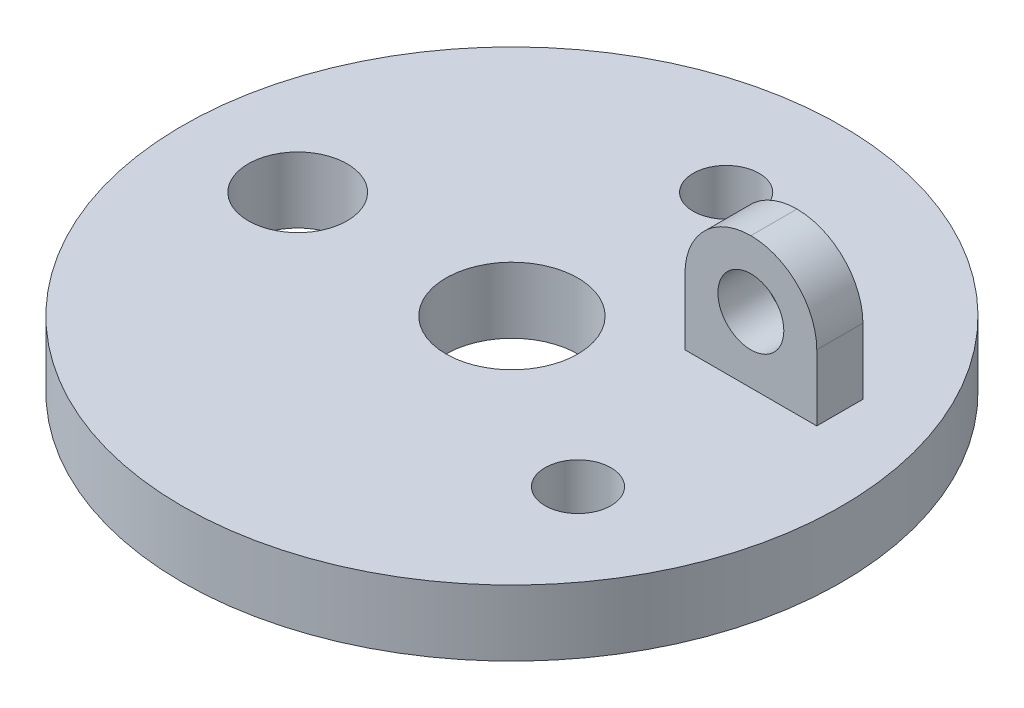
ISO-10303-21;
HEADER;
FILE_DESCRIPTION(('STEP AP214'),'2;1');
FILE_NAME('part.step','',(''),(''),'','','');
FILE_SCHEMA(('AUTOMOTIVE_DESIGN { 1 0 10303 214 1 1 1 1 }'));
ENDSEC;
DATA;
#1=APPLICATION_CONTEXT('core data for automotive mechanical design processes');
#2=APPLICATION_PROTOCOL_DEFINITION('international standard','automotive_design',2000,#1);
#3=PRODUCT_CONTEXT('',#1,'mechanical');
#4=PRODUCT('Part','Part','',(#3));
#5=PRODUCT_RELATED_PRODUCT_CATEGORY('part','',(#4));
#6=PRODUCT_DEFINITION_FORMATION('','',#4);
#7=PRODUCT_DEFINITION_CONTEXT('part definition',#1,'design');
#8=PRODUCT_DEFINITION('design','',#6,#7);
#9=PRODUCT_DEFINITION_SHAPE('','',#8);
#10=(LENGTH_UNIT() NAMED_UNIT(*) SI_UNIT(.MILLI.,.METRE.));
#11=(NAMED_UNIT(*) PLANE_ANGLE_UNIT() SI_UNIT($,.RADIAN.));
#12=(NAMED_UNIT(*) SI_UNIT($,.STERADIAN.) SOLID_ANGLE_UNIT());
#13=UNCERTAINTY_MEASURE_WITH_UNIT(LENGTH_MEASURE(1.E-05),#10,'distance_accuracy_value','');
#14=(GEOMETRIC_REPRESENTATION_CONTEXT(3) GLOBAL_UNCERTAINTY_ASSIGNED_CONTEXT((#13)) GLOBAL_UNIT_ASSIGNED_CONTEXT((#10,
#11,#12)) REPRESENTATION_CONTEXT('',''));
#15=CARTESIAN_POINT('',(0.,0.,0.));
#16=DIRECTION('',(0.,0.,1.));
#17=DIRECTION('',(1.,0.,0.));
#18=AXIS2_PLACEMENT_3D('',#15,#16,#17);
#19=CARTESIAN_POINT('',(0.,5.,0.));
#20=DIRECTION('',(0.,1.,0.));
#21=DIRECTION('',(0.,0.,1.));
#22=AXIS2_PLACEMENT_3D('',#19,#20,#21);
#23=PLANE('',#22);
#24=CARTESIAN_POINT('',(0.,5.,-32.5));
#25=DIRECTION('',(0.,1.,0.));
#26=DIRECTION('',(0.,0.,1.));
#27=AXIS2_PLACEMENT_3D('',#24,#25,#26);
#28=CIRCLE('',#27,5.);
#29=CARTESIAN_POINT('',(0.,5.,-27.5));
#30=VERTEX_POINT('',#29);
#31=EDGE_CURVE('E136',#30,#30,#28,.T.);
#32=ORIENTED_EDGE('',*,*,#31,.F.);
#33=EDGE_LOOP('',(#32));
#34=FACE_BOUND('',#33,.T.);
#35=CARTESIAN_POINT('',(27.4382616598463,5.,17.4181456270697));
#36=DIRECTION('',(0.,1.,0.));
#37=DIRECTION('',(0.,0.,1.));
#38=AXIS2_PLACEMENT_3D('',#35,#36,#37);
#39=CIRCLE('',#38,5.);
#40=CARTESIAN_POINT('',(27.4382616598463,5.,22.4181456270697));
#41=VERTEX_POINT('',#40);
#42=EDGE_CURVE('E152',#41,#41,#39,.T.);
#43=ORIENTED_EDGE('',*,*,#42,.F.);
#44=EDGE_LOOP('',(#43));
#45=FACE_BOUND('',#44,.T.);
#46=CARTESIAN_POINT('',(0.,5.,0.));
#47=DIRECTION('',(0.,1.,0.));
#48=DIRECTION('',(0.,0.,1.));
#49=AXIS2_PLACEMENT_3D('',#46,#47,#48);
#50=CIRCLE('',#49,50.);
#51=CARTESIAN_POINT('',(0.,5.,50.));
#52=VERTEX_POINT('',#51);
#53=EDGE_CURVE('E160',#52,#52,#50,.T.);
#54=ORIENTED_EDGE('',*,*,#53,.T.);
#55=EDGE_LOOP('',(#54));
#56=FACE_BOUND('',#55,.T.);
#57=CARTESIAN_POINT('',(-32.5,5.,0.));
#58=DIRECTION('',(0.,1.,0.));
#59=DIRECTION('',(0.,0.,1.));
#60=AXIS2_PLACEMENT_3D('',#57,#58,#59);
#61=CIRCLE('',#60,7.5);
#62=CARTESIAN_POINT('',(-32.5,5.,7.5));
#63=VERTEX_POINT('',#62);
#64=EDGE_CURVE('E144',#63,#63,#61,.T.);
#65=ORIENTED_EDGE('',*,*,#64,.F.);
#66=EDGE_LOOP('',(#65));
#67=FACE_BOUND('',#66,.T.);
#68=CARTESIAN_POINT('',(0.,5.,0.));
#69=DIRECTION('',(0.,1.,0.));
#70=DIRECTION('',(0.,0.,1.));
#71=AXIS2_PLACEMENT_3D('',#68,#69,#70);
#72=CIRCLE('',#71,10.);
#73=CARTESIAN_POINT('',(0.,5.,10.));
#74=VERTEX_POINT('',#73);
#75=EDGE_CURVE('E128',#74,#74,#72,.T.);
#76=ORIENTED_EDGE('',*,*,#75,.F.);
#77=EDGE_LOOP('',(#76));
#78=FACE_BOUND('',#77,.T.);
#79=DIRECTION('',(-1.,0.,0.));
#80=VECTOR('',#79,1.);
#81=CARTESIAN_POINT('',(17.5709758475848,5.,-15.6757175717572));
#82=LINE('',#81,#80);
#83=CARTESIAN_POINT('',(37.5709758475848,5.,-15.6757175717572));
#84=VERTEX_POINT('',#83);
#85=CARTESIAN_POINT('',(17.5709758475848,5.,-15.6757175717572));
#86=VERTEX_POINT('',#85);
#87=EDGE_CURVE('E91',#84,#86,#82,.T.);
#88=ORIENTED_EDGE('',*,*,#87,.F.);
#89=DIRECTION('',(0.,0.,-1.));
#90=VECTOR('',#89,1.);
#91=CARTESIAN_POINT('',(37.5709758475848,5.,-15.6757175717572));
#92=LINE('',#91,#90);
#93=CARTESIAN_POINT('',(37.5709758475848,5.,-8.6757175717572));
#94=VERTEX_POINT('',#93);
#95=EDGE_CURVE('E100',#94,#84,#92,.T.);
#96=ORIENTED_EDGE('',*,*,#95,.F.);
#97=DIRECTION('',(1.,0.,0.));
#98=VECTOR('',#97,1.);
#99=CARTESIAN_POINT('',(17.5709758475848,5.,-8.6757175717572));
#100=LINE('',#99,#98);
#101=CARTESIAN_POINT('',(17.5709758475848,5.,-8.6757175717572));
#102=VERTEX_POINT('',#101);
#103=EDGE_CURVE('E115',#102,#94,#100,.T.);
#104=ORIENTED_EDGE('',*,*,#103,.F.);
#105=DIRECTION('',(0.,0.,1.));
#106=VECTOR('',#105,1.);
#107=CARTESIAN_POINT('',(17.5709758475848,5.,-15.6757175717572));
#108=LINE('',#107,#106);
#109=EDGE_CURVE('E110',#86,#102,#108,.T.);
#110=ORIENTED_EDGE('',*,*,#109,.F.);
#111=EDGE_LOOP('',(#88,#96,#104,#110));
#112=FACE_BOUND('',#111,.T.);
#113=ADVANCED_FACE('F44',(#34,#45,#56,#67,#78,#112),#23,.T.);
#114=CARTESIAN_POINT('',(0.,-5.,0.));
#115=DIRECTION('',(0.,1.,0.));
#116=DIRECTION('',(0.,0.,1.));
#117=AXIS2_PLACEMENT_3D('',#114,#115,#116);
#118=PLANE('',#117);
#119=CARTESIAN_POINT('',(0.,-5.,0.));
#120=DIRECTION('',(0.,1.,0.));
#121=DIRECTION('',(0.,0.,1.));
#122=AXIS2_PLACEMENT_3D('',#119,#120,#121);
#123=CIRCLE('',#122,50.);
#124=CARTESIAN_POINT('',(0.,-5.,50.));
#125=VERTEX_POINT('',#124);
#126=EDGE_CURVE('E156',#125,#125,#123,.T.);
#127=ORIENTED_EDGE('',*,*,#126,.F.);
#128=EDGE_LOOP('',(#127));
#129=FACE_BOUND('',#128,.T.);
#130=CARTESIAN_POINT('',(27.4382616598463,-5.,17.4181456270697));
#131=DIRECTION('',(0.,1.,0.));
#132=DIRECTION('',(0.,0.,1.));
#133=AXIS2_PLACEMENT_3D('',#130,#131,#132);
#134=CIRCLE('',#133,5.);
#135=CARTESIAN_POINT('',(27.4382616598463,-5.,22.4181456270697));
#136=VERTEX_POINT('',#135);
#137=EDGE_CURVE('E148',#136,#136,#134,.T.);
#138=ORIENTED_EDGE('',*,*,#137,.T.);
#139=EDGE_LOOP('',(#138));
#140=FACE_BOUND('',#139,.T.);
#141=CARTESIAN_POINT('',(-32.5,-5.,0.));
#142=DIRECTION('',(0.,1.,0.));
#143=DIRECTION('',(0.,0.,1.));
#144=AXIS2_PLACEMENT_3D('',#141,#142,#143);
#145=CIRCLE('',#144,7.5);
#146=CARTESIAN_POINT('',(-32.5,-5.,7.5));
#147=VERTEX_POINT('',#146);
#148=EDGE_CURVE('E140',#147,#147,#145,.T.);
#149=ORIENTED_EDGE('',*,*,#148,.T.);
#150=EDGE_LOOP('',(#149));
#151=FACE_BOUND('',#150,.T.);
#152=CARTESIAN_POINT('',(0.,-5.,-32.5));
#153=DIRECTION('',(0.,1.,0.));
#154=DIRECTION('',(0.,0.,1.));
#155=AXIS2_PLACEMENT_3D('',#152,#153,#154);
#156=CIRCLE('',#155,5.);
#157=CARTESIAN_POINT('',(0.,-5.,-27.5));
#158=VERTEX_POINT('',#157);
#159=EDGE_CURVE('E132',#158,#158,#156,.T.);
#160=ORIENTED_EDGE('',*,*,#159,.T.);
#161=EDGE_LOOP('',(#160));
#162=FACE_BOUND('',#161,.T.);
#163=CARTESIAN_POINT('',(0.,-5.,0.));
#164=DIRECTION('',(0.,1.,0.));
#165=DIRECTION('',(0.,0.,1.));
#166=AXIS2_PLACEMENT_3D('',#163,#164,#165);
#167=CIRCLE('',#166,10.);
#168=CARTESIAN_POINT('',(0.,-5.,10.));
#169=VERTEX_POINT('',#168);
#170=EDGE_CURVE('E96',#169,#169,#167,.T.);
#171=ORIENTED_EDGE('',*,*,#170,.T.);
#172=EDGE_LOOP('',(#171));
#173=FACE_BOUND('',#172,.T.);
#174=ADVANCED_FACE('F268',(#129,#140,#151,#162,#173),#118,.F.);
#175=CARTESIAN_POINT('',(0.,5.,0.));
#176=DIRECTION('',(0.,-1.,0.));
#177=DIRECTION('',(0.,0.,-1.));
#178=AXIS2_PLACEMENT_3D('',#175,#176,#177);
#179=CYLINDRICAL_SURFACE('',#178,50.);
#180=ORIENTED_EDGE('',*,*,#53,.F.);
#181=EDGE_LOOP('',(#180));
#182=FACE_BOUND('',#181,.T.);
#183=ORIENTED_EDGE('',*,*,#126,.T.);
#184=EDGE_LOOP('',(#183));
#185=FACE_BOUND('',#184,.T.);
#186=ADVANCED_FACE('F274',(#182,#185),#179,.T.);
#187=CARTESIAN_POINT('',(27.4382616598463,5.,17.4181456270697));
#188=DIRECTION('',(0.,-1.,0.));
#189=DIRECTION('',(0.,0.,-1.));
#190=AXIS2_PLACEMENT_3D('',#187,#188,#189);
#191=CYLINDRICAL_SURFACE('',#190,5.);
#192=ORIENTED_EDGE('',*,*,#42,.T.);
#193=EDGE_LOOP('',(#192));
#194=FACE_BOUND('',#193,.T.);
#195=ORIENTED_EDGE('',*,*,#137,.F.);
#196=EDGE_LOOP('',(#195));
#197=FACE_BOUND('',#196,.T.);
#198=ADVANCED_FACE('F280',(#194,#197),#191,.F.);
#199=CARTESIAN_POINT('',(-32.5,5.,0.));
#200=DIRECTION('',(0.,-1.,0.));
#201=DIRECTION('',(0.,0.,-1.));
#202=AXIS2_PLACEMENT_3D('',#199,#200,#201);
#203=CYLINDRICAL_SURFACE('',#202,7.5);
#204=ORIENTED_EDGE('',*,*,#64,.T.);
#205=EDGE_LOOP('',(#204));
#206=FACE_BOUND('',#205,.T.);
#207=ORIENTED_EDGE('',*,*,#148,.F.);
#208=EDGE_LOOP('',(#207));
#209=FACE_BOUND('',#208,.T.);
#210=ADVANCED_FACE('F338',(#206,#209),#203,.F.);
#211=CARTESIAN_POINT('',(0.,5.,-32.5));
#212=DIRECTION('',(0.,-1.,0.));
#213=DIRECTION('',(0.,0.,-1.));
#214=AXIS2_PLACEMENT_3D('',#211,#212,#213);
#215=CYLINDRICAL_SURFACE('',#214,5.);
#216=ORIENTED_EDGE('',*,*,#31,.T.);
#217=EDGE_LOOP('',(#216));
#218=FACE_BOUND('',#217,.T.);
#219=ORIENTED_EDGE('',*,*,#159,.F.);
#220=EDGE_LOOP('',(#219));
#221=FACE_BOUND('',#220,.T.);
#222=ADVANCED_FACE('F328',(#218,#221),#215,.F.);
#223=CARTESIAN_POINT('',(0.,5.,0.));
#224=DIRECTION('',(0.,-1.,0.));
#225=DIRECTION('',(0.,0.,-1.));
#226=AXIS2_PLACEMENT_3D('',#223,#224,#225);
#227=CYLINDRICAL_SURFACE('',#226,10.);
#228=ORIENTED_EDGE('',*,*,#75,.T.);
#229=EDGE_LOOP('',(#228));
#230=FACE_BOUND('',#229,.T.);
#231=ORIENTED_EDGE('',*,*,#170,.F.);
#232=EDGE_LOOP('',(#231));
#233=FACE_BOUND('',#232,.T.);
#234=ADVANCED_FACE('F318',(#230,#233),#227,.F.);
#235=CARTESIAN_POINT('',(37.5709758475848,25.,-15.6757175717572));
#236=DIRECTION('',(-1.,0.,0.));
#237=DIRECTION('',(0.,0.,1.));
#238=AXIS2_PLACEMENT_3D('',#235,#236,#237);
#239=PLANE('',#238);
#240=DIRECTION('',(0.,-1.,0.));
#241=VECTOR('',#240,1.);
#242=CARTESIAN_POINT('',(37.5709758475848,25.,-15.6757175717572));
#243=LINE('',#242,#241);
#244=CARTESIAN_POINT('',(37.5709758475848,15.,-15.6757175717572));
#245=VERTEX_POINT('',#244);
#246=EDGE_CURVE('E87',#245,#84,#243,.T.);
#247=ORIENTED_EDGE('',*,*,#246,.F.);
#248=DIRECTION('',(0.,0.,-1.));
#249=VECTOR('',#248,1.);
#250=CARTESIAN_POINT('',(37.5709758475848,15.,-8.6757175717572));
#251=LINE('',#250,#249);
#252=CARTESIAN_POINT('',(37.5709758475848,15.,-8.6757175717572));
#253=VERTEX_POINT('',#252);
#254=EDGE_CURVE('E11',#245,#253,#251,.F.);
#255=ORIENTED_EDGE('',*,*,#254,.T.);
#256=DIRECTION('',(0.,-1.,0.));
#257=VECTOR('',#256,1.);
#258=CARTESIAN_POINT('',(37.5709758475848,25.,-8.6757175717572));
#259=LINE('',#258,#257);
#260=EDGE_CURVE('E103',#253,#94,#259,.T.);
#261=ORIENTED_EDGE('',*,*,#260,.T.);
#262=ORIENTED_EDGE('',*,*,#95,.T.);
#263=EDGE_LOOP('',(#247,#255,#261,#262));
#264=FACE_BOUND('',#263,.T.);
#265=ADVANCED_FACE('F101',(#264),#239,.F.);
#266=CARTESIAN_POINT('',(17.5709758475848,25.,-15.6757175717572));
#267=DIRECTION('',(0.,0.,1.));
#268=DIRECTION('',(1.,0.,0.));
#269=AXIS2_PLACEMENT_3D('',#266,#267,#268);
#270=PLANE('',#269);
#271=CARTESIAN_POINT('',(27.5709758475848,15.,-15.6757175717572));
#272=DIRECTION('',(0.,0.,1.));
#273=DIRECTION('',(1.,0.,0.));
#274=AXIS2_PLACEMENT_3D('',#271,#272,#273);
#275=CIRCLE('',#274,5.);
#276=CARTESIAN_POINT('',(32.5709758475848,15.,-15.6757175717572));
#277=VERTEX_POINT('',#276);
#278=EDGE_CURVE('E231',#277,#277,#275,.T.);
#279=ORIENTED_EDGE('',*,*,#278,.T.);
#280=EDGE_LOOP('',(#279));
#281=FACE_BOUND('',#280,.T.);
#282=DIRECTION('',(0.,-1.,0.));
#283=VECTOR('',#282,1.);
#284=CARTESIAN_POINT('',(17.5709758475848,25.,-15.6757175717572));
#285=LINE('',#284,#283);
#286=CARTESIAN_POINT('',(17.5709758475848,15.,-15.6757175717572));
#287=VERTEX_POINT('',#286);
#288=EDGE_CURVE('E97',#287,#86,#285,.T.);
#289=ORIENTED_EDGE('',*,*,#288,.F.);
#290=CARTESIAN_POINT('',(27.5709758475848,15.,-15.6757175717572));
#291=DIRECTION('',(0.,0.,1.));
#292=DIRECTION('',(1.,0.,0.));
#293=AXIS2_PLACEMENT_3D('',#290,#291,#292);
#294=CIRCLE('',#293,10.);
#295=CARTESIAN_POINT('',(27.5709758475848,25.,-15.6757175717572));
#296=VERTEX_POINT('',#295);
#297=EDGE_CURVE('E54',#287,#296,#294,.F.);
#298=ORIENTED_EDGE('',*,*,#297,.T.);
#299=CARTESIAN_POINT('',(27.5709758475848,15.,-15.6757175717572));
#300=DIRECTION('',(0.,0.,1.));
#301=DIRECTION('',(1.,0.,0.));
#302=AXIS2_PLACEMENT_3D('',#299,#300,#301);
#303=CIRCLE('',#302,10.);
#304=EDGE_CURVE('E61',#296,#245,#303,.F.);
#305=ORIENTED_EDGE('',*,*,#304,.T.);
#306=ORIENTED_EDGE('',*,*,#246,.T.);
#307=ORIENTED_EDGE('',*,*,#87,.T.);
#308=EDGE_LOOP('',(#289,#298,#305,#306,#307));
#309=FACE_BOUND('',#308,.T.);
#310=ADVANCED_FACE('F89',(#281,#309),#270,.F.);
#311=CARTESIAN_POINT('',(17.5709758475848,25.,-15.6757175717572));
#312=DIRECTION('',(1.,0.,0.));
#313=DIRECTION('',(0.,0.,-1.));
#314=AXIS2_PLACEMENT_3D('',#311,#312,#313);
#315=PLANE('',#314);
#316=DIRECTION('',(0.,-1.,0.));
#317=VECTOR('',#316,1.);
#318=CARTESIAN_POINT('',(17.5709758475848,25.,-8.6757175717572));
#319=LINE('',#318,#317);
#320=CARTESIAN_POINT('',(17.5709758475848,15.,-8.6757175717572));
#321=VERTEX_POINT('',#320);
#322=EDGE_CURVE('E123',#321,#102,#319,.T.);
#323=ORIENTED_EDGE('',*,*,#322,.F.);
#324=DIRECTION('',(0.,0.,1.));
#325=VECTOR('',#324,1.);
#326=CARTESIAN_POINT('',(17.5709758475848,15.,-15.6757175717572));
#327=LINE('',#326,#325);
#328=EDGE_CURVE('E173',#321,#287,#327,.F.);
#329=ORIENTED_EDGE('',*,*,#328,.T.);
#330=ORIENTED_EDGE('',*,*,#288,.T.);
#331=ORIENTED_EDGE('',*,*,#109,.T.);
#332=EDGE_LOOP('',(#323,#329,#330,#331));
#333=FACE_BOUND('',#332,.T.);
#334=ADVANCED_FACE('F249',(#333),#315,.F.);
#335=CARTESIAN_POINT('',(17.5709758475848,25.,-8.6757175717572));
#336=DIRECTION('',(0.,0.,-1.));
#337=DIRECTION('',(-1.,0.,0.));
#338=AXIS2_PLACEMENT_3D('',#335,#336,#337);
#339=PLANE('',#338);
#340=CARTESIAN_POINT('',(27.5709758475848,15.,-8.6757175717572));
#341=DIRECTION('',(0.,0.,1.));
#342=DIRECTION('',(1.,0.,0.));
#343=AXIS2_PLACEMENT_3D('',#340,#341,#342);
#344=CIRCLE('',#343,5.);
#345=CARTESIAN_POINT('',(32.5709758475848,15.,-8.6757175717572));
#346=VERTEX_POINT('',#345);
#347=EDGE_CURVE('E236',#346,#346,#344,.T.);
#348=ORIENTED_EDGE('',*,*,#347,.F.);
#349=EDGE_LOOP('',(#348));
#350=FACE_BOUND('',#349,.T.);
#351=CARTESIAN_POINT('',(27.5709758475848,15.,-8.6757175717572));
#352=DIRECTION('',(0.,0.,-1.));
#353=DIRECTION('',(-1.,0.,0.));
#354=AXIS2_PLACEMENT_3D('',#351,#352,#353);
#355=CIRCLE('',#354,10.);
#356=CARTESIAN_POINT('',(27.5709758475848,25.,-8.6757175717572));
#357=VERTEX_POINT('',#356);
#358=EDGE_CURVE('E164',#253,#357,#355,.F.);
#359=ORIENTED_EDGE('',*,*,#358,.T.);
#360=CARTESIAN_POINT('',(27.5709758475848,15.,-8.6757175717572));
#361=DIRECTION('',(0.,0.,-1.));
#362=DIRECTION('',(-1.,0.,0.));
#363=AXIS2_PLACEMENT_3D('',#360,#361,#362);
#364=CIRCLE('',#363,10.);
#365=EDGE_CURVE('E170',#357,#321,#364,.F.);
#366=ORIENTED_EDGE('',*,*,#365,.T.);
#367=ORIENTED_EDGE('',*,*,#322,.T.);
#368=ORIENTED_EDGE('',*,*,#103,.T.);
#369=ORIENTED_EDGE('',*,*,#260,.F.);
#370=EDGE_LOOP('',(#359,#366,#367,#368,#369));
#371=FACE_BOUND('',#370,.T.);
#372=ADVANCED_FACE('F246',(#350,#371),#339,.F.);
#373=CARTESIAN_POINT('',(27.5709758475848,15.,0.));
#374=DIRECTION('',(0.,0.,1.));
#375=DIRECTION('',(1.,0.,0.));
#376=AXIS2_PLACEMENT_3D('',#373,#374,#375);
#377=CYLINDRICAL_SURFACE('',#376,10.);
#378=ORIENTED_EDGE('',*,*,#254,.F.);
#379=ORIENTED_EDGE('',*,*,#304,.F.);
#380=DIRECTION('',(0.,0.,-1.));
#381=VECTOR('',#380,1.);
#382=CARTESIAN_POINT('',(27.5709758475848,25.,-15.6757175717572));
#383=LINE('',#382,#381);
#384=EDGE_CURVE('E48',#357,#296,#383,.T.);
#385=ORIENTED_EDGE('',*,*,#384,.F.);
#386=ORIENTED_EDGE('',*,*,#358,.F.);
#387=EDGE_LOOP('',(#378,#379,#385,#386));
#388=FACE_BOUND('',#387,.T.);
#389=ADVANCED_FACE('F46',(#388),#377,.T.);
#390=CARTESIAN_POINT('',(27.5709758475848,15.,0.));
#391=DIRECTION('',(0.,0.,-1.));
#392=DIRECTION('',(-1.,0.,0.));
#393=AXIS2_PLACEMENT_3D('',#390,#391,#392);
#394=CYLINDRICAL_SURFACE('',#393,10.);
#395=ORIENTED_EDGE('',*,*,#297,.F.);
#396=ORIENTED_EDGE('',*,*,#328,.F.);
#397=ORIENTED_EDGE('',*,*,#365,.F.);
#398=ORIENTED_EDGE('',*,*,#384,.T.);
#399=EDGE_LOOP('',(#395,#396,#397,#398));
#400=FACE_BOUND('',#399,.T.);
#401=ADVANCED_FACE('F258',(#400),#394,.T.);
#402=CARTESIAN_POINT('',(27.5709758475848,15.,-50.));
#403=DIRECTION('',(0.,0.,1.));
#404=DIRECTION('',(1.,0.,0.));
#405=AXIS2_PLACEMENT_3D('',#402,#403,#404);
#406=CYLINDRICAL_SURFACE('',#405,5.);
#407=ORIENTED_EDGE('',*,*,#347,.T.);
#408=EDGE_LOOP('',(#407));
#409=FACE_BOUND('',#408,.T.);
#410=ORIENTED_EDGE('',*,*,#278,.F.);
#411=EDGE_LOOP('',(#410));
#412=FACE_BOUND('',#411,.T.);
#413=ADVANCED_FACE('F243',(#409,#412),#406,.F.);
#414=CLOSED_SHELL('',(#113,#174,#186,#198,#210,#222,#234,#265,#310,#334,#372,#389,#401,#413));
#415=MANIFOLD_SOLID_BREP('B2',#414);
#416=ADVANCED_BREP_SHAPE_REPRESENTATION('',(#18,#415),#14);
#417=SHAPE_DEFINITION_REPRESENTATION(#9,#416);
ENDSEC;
END-ISO-10303-21;
